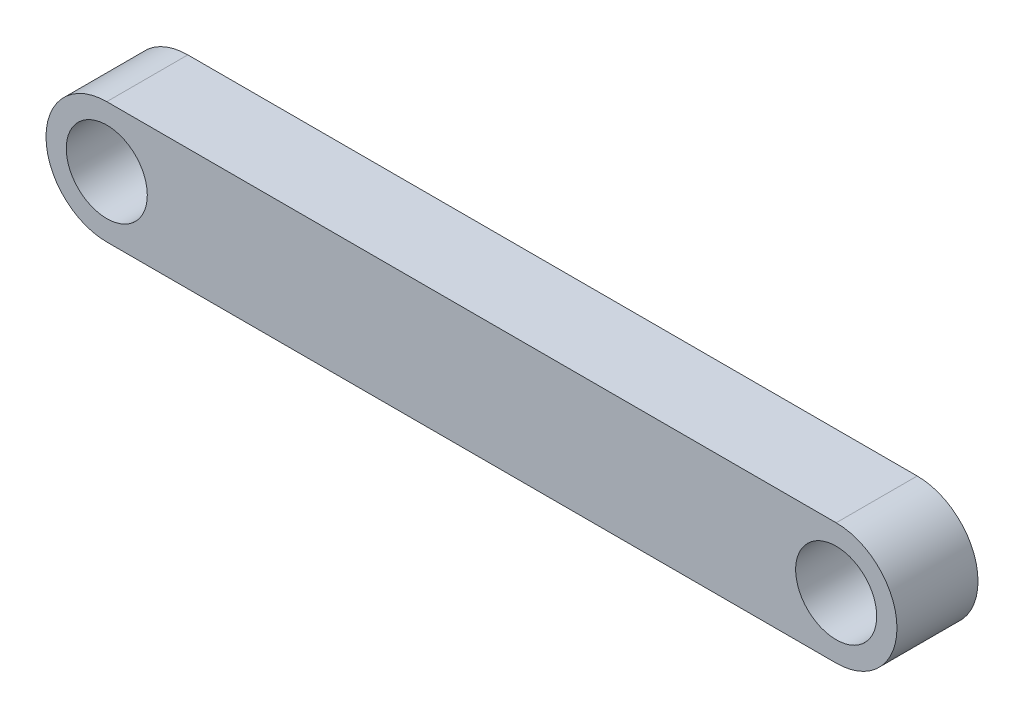
ISO-10303-21;
HEADER;
FILE_DESCRIPTION(('STEP AP214'),'2;1');
FILE_NAME('part.step','',(''),(''),'','','');
FILE_SCHEMA(('AUTOMOTIVE_DESIGN { 1 0 10303 214 1 1 1 1 }'));
ENDSEC;
DATA;
#1=APPLICATION_CONTEXT('core data for automotive mechanical design processes');
#2=APPLICATION_PROTOCOL_DEFINITION('international standard','automotive_design',2000,#1);
#3=PRODUCT_CONTEXT('',#1,'mechanical');
#4=PRODUCT('Part','Part','',(#3));
#5=PRODUCT_RELATED_PRODUCT_CATEGORY('part','',(#4));
#6=PRODUCT_DEFINITION_FORMATION('','',#4);
#7=PRODUCT_DEFINITION_CONTEXT('part definition',#1,'design');
#8=PRODUCT_DEFINITION('design','',#6,#7);
#9=PRODUCT_DEFINITION_SHAPE('','',#8);
#10=(LENGTH_UNIT() NAMED_UNIT(*) SI_UNIT(.MILLI.,.METRE.));
#11=(NAMED_UNIT(*) PLANE_ANGLE_UNIT() SI_UNIT($,.RADIAN.));
#12=(NAMED_UNIT(*) SI_UNIT($,.STERADIAN.) SOLID_ANGLE_UNIT());
#13=UNCERTAINTY_MEASURE_WITH_UNIT(LENGTH_MEASURE(1.E-05),#10,'distance_accuracy_value','');
#14=(GEOMETRIC_REPRESENTATION_CONTEXT(3) GLOBAL_UNCERTAINTY_ASSIGNED_CONTEXT((#13)) GLOBAL_UNIT_ASSIGNED_CONTEXT((#10,
#11,#12)) REPRESENTATION_CONTEXT('',''));
#15=CARTESIAN_POINT('',(0.,0.,0.));
#16=DIRECTION('',(0.,0.,1.));
#17=DIRECTION('',(1.,0.,0.));
#18=AXIS2_PLACEMENT_3D('',#15,#16,#17);
#19=CARTESIAN_POINT('',(-17.8588235294118,0.,4.));
#20=DIRECTION('',(0.,0.,1.));
#21=DIRECTION('',(1.,0.,0.));
#22=AXIS2_PLACEMENT_3D('',#19,#20,#21);
#23=PLANE('',#22);
#24=CARTESIAN_POINT('',(-17.8588235294118,0.,4.));
#25=DIRECTION('',(0.,0.,1.));
#26=DIRECTION('',(1.,0.,0.));
#27=AXIS2_PLACEMENT_3D('',#24,#25,#26);
#28=CIRCLE('',#27,2.);
#29=CARTESIAN_POINT('',(-15.8588235294118,0.,4.));
#30=VERTEX_POINT('',#29);
#31=EDGE_CURVE('E104',#30,#30,#28,.T.);
#32=ORIENTED_EDGE('',*,*,#31,.F.);
#33=EDGE_LOOP('',(#32));
#34=FACE_BOUND('',#33,.T.);
#35=CARTESIAN_POINT('',(-17.8588235294118,0.,4.));
#36=DIRECTION('',(0.,0.,1.));
#37=DIRECTION('',(1.,0.,0.));
#38=AXIS2_PLACEMENT_3D('',#35,#36,#37);
#39=CIRCLE('',#38,3.);
#40=CARTESIAN_POINT('',(-17.8588235294118,3.,4.));
#41=VERTEX_POINT('',#40);
#42=CARTESIAN_POINT('',(-17.8588235294118,-3.,4.));
#43=VERTEX_POINT('',#42);
#44=EDGE_CURVE('E89',#41,#43,#39,.T.);
#45=ORIENTED_EDGE('',*,*,#44,.T.);
#46=DIRECTION('',(1.,0.,0.));
#47=VECTOR('',#46,1.);
#48=CARTESIAN_POINT('',(-17.8588235294118,-3.,4.));
#49=LINE('',#48,#47);
#50=CARTESIAN_POINT('',(18.1411764705882,-3.,4.));
#51=VERTEX_POINT('',#50);
#52=EDGE_CURVE('E84',#43,#51,#49,.T.);
#53=ORIENTED_EDGE('',*,*,#52,.T.);
#54=CARTESIAN_POINT('',(18.1411764705882,0.,4.));
#55=DIRECTION('',(0.,0.,1.));
#56=DIRECTION('',(1.,0.,0.));
#57=AXIS2_PLACEMENT_3D('',#54,#55,#56);
#58=CIRCLE('',#57,3.);
#59=CARTESIAN_POINT('',(18.1411764705882,3.,4.));
#60=VERTEX_POINT('',#59);
#61=EDGE_CURVE('E87',#51,#60,#58,.T.);
#62=ORIENTED_EDGE('',*,*,#61,.T.);
#63=DIRECTION('',(-1.,0.,0.));
#64=VECTOR('',#63,1.);
#65=CARTESIAN_POINT('',(-17.8588235294118,3.,4.));
#66=LINE('',#65,#64);
#67=EDGE_CURVE('E54',#60,#41,#66,.T.);
#68=ORIENTED_EDGE('',*,*,#67,.T.);
#69=EDGE_LOOP('',(#45,#53,#62,#68));
#70=FACE_BOUND('',#69,.T.);
#71=CARTESIAN_POINT('',(18.1411764705882,0.,4.));
#72=DIRECTION('',(0.,0.,1.));
#73=DIRECTION('',(1.,0.,0.));
#74=AXIS2_PLACEMENT_3D('',#71,#72,#73);
#75=CIRCLE('',#74,2.);
#76=CARTESIAN_POINT('',(20.1411764705882,0.,4.));
#77=VERTEX_POINT('',#76);
#78=EDGE_CURVE('E119',#77,#77,#75,.T.);
#79=ORIENTED_EDGE('',*,*,#78,.F.);
#80=EDGE_LOOP('',(#79));
#81=FACE_BOUND('',#80,.T.);
#82=ADVANCED_FACE('F37',(#34,#70,#81),#23,.T.);
#83=CARTESIAN_POINT('',(-17.8588235294118,0.,0.));
#84=DIRECTION('',(0.,0.,1.));
#85=DIRECTION('',(1.,0.,0.));
#86=AXIS2_PLACEMENT_3D('',#83,#84,#85);
#87=PLANE('',#86);
#88=CARTESIAN_POINT('',(-17.8588235294118,0.,0.));
#89=DIRECTION('',(0.,0.,1.));
#90=DIRECTION('',(1.,0.,0.));
#91=AXIS2_PLACEMENT_3D('',#88,#89,#90);
#92=CIRCLE('',#91,3.);
#93=CARTESIAN_POINT('',(-17.8588235294118,3.,0.));
#94=VERTEX_POINT('',#93);
#95=CARTESIAN_POINT('',(-17.8588235294118,-3.,0.));
#96=VERTEX_POINT('',#95);
#97=EDGE_CURVE('E101',#94,#96,#92,.T.);
#98=ORIENTED_EDGE('',*,*,#97,.F.);
#99=DIRECTION('',(-1.,0.,0.));
#100=VECTOR('',#99,1.);
#101=CARTESIAN_POINT('',(-17.8588235294118,3.,0.));
#102=LINE('',#101,#100);
#103=CARTESIAN_POINT('',(18.1411764705882,3.,0.));
#104=VERTEX_POINT('',#103);
#105=EDGE_CURVE('E77',#104,#94,#102,.T.);
#106=ORIENTED_EDGE('',*,*,#105,.F.);
#107=CARTESIAN_POINT('',(18.1411764705882,0.,0.));
#108=DIRECTION('',(0.,0.,1.));
#109=DIRECTION('',(1.,0.,0.));
#110=AXIS2_PLACEMENT_3D('',#107,#108,#109);
#111=CIRCLE('',#110,3.);
#112=CARTESIAN_POINT('',(18.1411764705882,-3.,0.));
#113=VERTEX_POINT('',#112);
#114=EDGE_CURVE('E71',#113,#104,#111,.T.);
#115=ORIENTED_EDGE('',*,*,#114,.F.);
#116=DIRECTION('',(1.,0.,0.));
#117=VECTOR('',#116,1.);
#118=CARTESIAN_POINT('',(-17.8588235294118,-3.,0.));
#119=LINE('',#118,#117);
#120=EDGE_CURVE('E93',#96,#113,#119,.T.);
#121=ORIENTED_EDGE('',*,*,#120,.F.);
#122=EDGE_LOOP('',(#98,#106,#115,#121));
#123=FACE_BOUND('',#122,.T.);
#124=CARTESIAN_POINT('',(-17.8588235294118,0.,0.));
#125=DIRECTION('',(0.,0.,1.));
#126=DIRECTION('',(1.,0.,0.));
#127=AXIS2_PLACEMENT_3D('',#124,#125,#126);
#128=CIRCLE('',#127,2.);
#129=CARTESIAN_POINT('',(-15.8588235294118,0.,0.));
#130=VERTEX_POINT('',#129);
#131=EDGE_CURVE('E116',#130,#130,#128,.T.);
#132=ORIENTED_EDGE('',*,*,#131,.T.);
#133=EDGE_LOOP('',(#132));
#134=FACE_BOUND('',#133,.T.);
#135=CARTESIAN_POINT('',(18.1411764705882,0.,0.));
#136=DIRECTION('',(0.,0.,1.));
#137=DIRECTION('',(1.,0.,0.));
#138=AXIS2_PLACEMENT_3D('',#135,#136,#137);
#139=CIRCLE('',#138,2.);
#140=CARTESIAN_POINT('',(20.1411764705882,0.,0.));
#141=VERTEX_POINT('',#140);
#142=EDGE_CURVE('E122',#141,#141,#139,.T.);
#143=ORIENTED_EDGE('',*,*,#142,.T.);
#144=EDGE_LOOP('',(#143));
#145=FACE_BOUND('',#144,.T.);
#146=ADVANCED_FACE('F112',(#123,#134,#145),#87,.F.);
#147=CARTESIAN_POINT('',(-17.8588235294118,0.,4.));
#148=DIRECTION('',(0.,0.,-1.));
#149=DIRECTION('',(-1.,0.,0.));
#150=AXIS2_PLACEMENT_3D('',#147,#148,#149);
#151=CYLINDRICAL_SURFACE('',#150,3.);
#152=ORIENTED_EDGE('',*,*,#97,.T.);
#153=DIRECTION('',(0.,0.,-1.));
#154=VECTOR('',#153,1.);
#155=CARTESIAN_POINT('',(-17.8588235294118,-3.,4.));
#156=LINE('',#155,#154);
#157=EDGE_CURVE('E11',#43,#96,#156,.T.);
#158=ORIENTED_EDGE('',*,*,#157,.F.);
#159=ORIENTED_EDGE('',*,*,#44,.F.);
#160=DIRECTION('',(0.,0.,-1.));
#161=VECTOR('',#160,1.);
#162=CARTESIAN_POINT('',(-17.8588235294118,3.,4.));
#163=LINE('',#162,#161);
#164=EDGE_CURVE('E97',#41,#94,#163,.T.);
#165=ORIENTED_EDGE('',*,*,#164,.T.);
#166=EDGE_LOOP('',(#152,#158,#159,#165));
#167=FACE_BOUND('',#166,.T.);
#168=ADVANCED_FACE('F39',(#167),#151,.T.);
#169=CARTESIAN_POINT('',(-17.8588235294118,-3.,4.));
#170=DIRECTION('',(0.,1.,0.));
#171=DIRECTION('',(-1.,0.,0.));
#172=AXIS2_PLACEMENT_3D('',#169,#170,#171);
#173=PLANE('',#172);
#174=ORIENTED_EDGE('',*,*,#120,.T.);
#175=DIRECTION('',(0.,0.,-1.));
#176=VECTOR('',#175,1.);
#177=CARTESIAN_POINT('',(18.1411764705882,-3.,4.));
#178=LINE('',#177,#176);
#179=EDGE_CURVE('E46',#51,#113,#178,.T.);
#180=ORIENTED_EDGE('',*,*,#179,.F.);
#181=ORIENTED_EDGE('',*,*,#52,.F.);
#182=ORIENTED_EDGE('',*,*,#157,.T.);
#183=EDGE_LOOP('',(#174,#180,#181,#182));
#184=FACE_BOUND('',#183,.T.);
#185=ADVANCED_FACE('F92',(#184),#173,.F.);
#186=CARTESIAN_POINT('',(18.1411764705882,0.,4.));
#187=DIRECTION('',(0.,0.,-1.));
#188=DIRECTION('',(-1.,0.,0.));
#189=AXIS2_PLACEMENT_3D('',#186,#187,#188);
#190=CYLINDRICAL_SURFACE('',#189,3.);
#191=ORIENTED_EDGE('',*,*,#114,.T.);
#192=DIRECTION('',(0.,0.,-1.));
#193=VECTOR('',#192,1.);
#194=CARTESIAN_POINT('',(18.1411764705882,3.,4.));
#195=LINE('',#194,#193);
#196=EDGE_CURVE('E94',#60,#104,#195,.T.);
#197=ORIENTED_EDGE('',*,*,#196,.F.);
#198=ORIENTED_EDGE('',*,*,#61,.F.);
#199=ORIENTED_EDGE('',*,*,#179,.T.);
#200=EDGE_LOOP('',(#191,#197,#198,#199));
#201=FACE_BOUND('',#200,.T.);
#202=ADVANCED_FACE('F95',(#201),#190,.T.);
#203=CARTESIAN_POINT('',(-17.8588235294118,3.,4.));
#204=DIRECTION('',(0.,-1.,0.));
#205=DIRECTION('',(1.,0.,0.));
#206=AXIS2_PLACEMENT_3D('',#203,#204,#205);
#207=PLANE('',#206);
#208=ORIENTED_EDGE('',*,*,#105,.T.);
#209=ORIENTED_EDGE('',*,*,#164,.F.);
#210=ORIENTED_EDGE('',*,*,#67,.F.);
#211=ORIENTED_EDGE('',*,*,#196,.T.);
#212=EDGE_LOOP('',(#208,#209,#210,#211));
#213=FACE_BOUND('',#212,.T.);
#214=ADVANCED_FACE('F109',(#213),#207,.F.);
#215=CARTESIAN_POINT('',(-17.8588235294118,0.,4.));
#216=DIRECTION('',(0.,0.,-1.));
#217=DIRECTION('',(-1.,0.,0.));
#218=AXIS2_PLACEMENT_3D('',#215,#216,#217);
#219=CYLINDRICAL_SURFACE('',#218,2.);
#220=ORIENTED_EDGE('',*,*,#31,.T.);
#221=EDGE_LOOP('',(#220));
#222=FACE_BOUND('',#221,.T.);
#223=ORIENTED_EDGE('',*,*,#131,.F.);
#224=EDGE_LOOP('',(#223));
#225=FACE_BOUND('',#224,.T.);
#226=ADVANCED_FACE('F139',(#222,#225),#219,.F.);
#227=CARTESIAN_POINT('',(18.1411764705882,0.,4.));
#228=DIRECTION('',(0.,0.,-1.));
#229=DIRECTION('',(-1.,0.,0.));
#230=AXIS2_PLACEMENT_3D('',#227,#228,#229);
#231=CYLINDRICAL_SURFACE('',#230,2.);
#232=ORIENTED_EDGE('',*,*,#78,.T.);
#233=EDGE_LOOP('',(#232));
#234=FACE_BOUND('',#233,.T.);
#235=ORIENTED_EDGE('',*,*,#142,.F.);
#236=EDGE_LOOP('',(#235));
#237=FACE_BOUND('',#236,.T.);
#238=ADVANCED_FACE('F128',(#234,#237),#231,.F.);
#239=CLOSED_SHELL('',(#82,#146,#168,#185,#202,#214,#226,#238));
#240=MANIFOLD_SOLID_BREP('B2',#239);
#241=ADVANCED_BREP_SHAPE_REPRESENTATION('',(#18,#240),#14);
#242=SHAPE_DEFINITION_REPRESENTATION(#9,#241);
ENDSEC;
END-ISO-10303-21;
